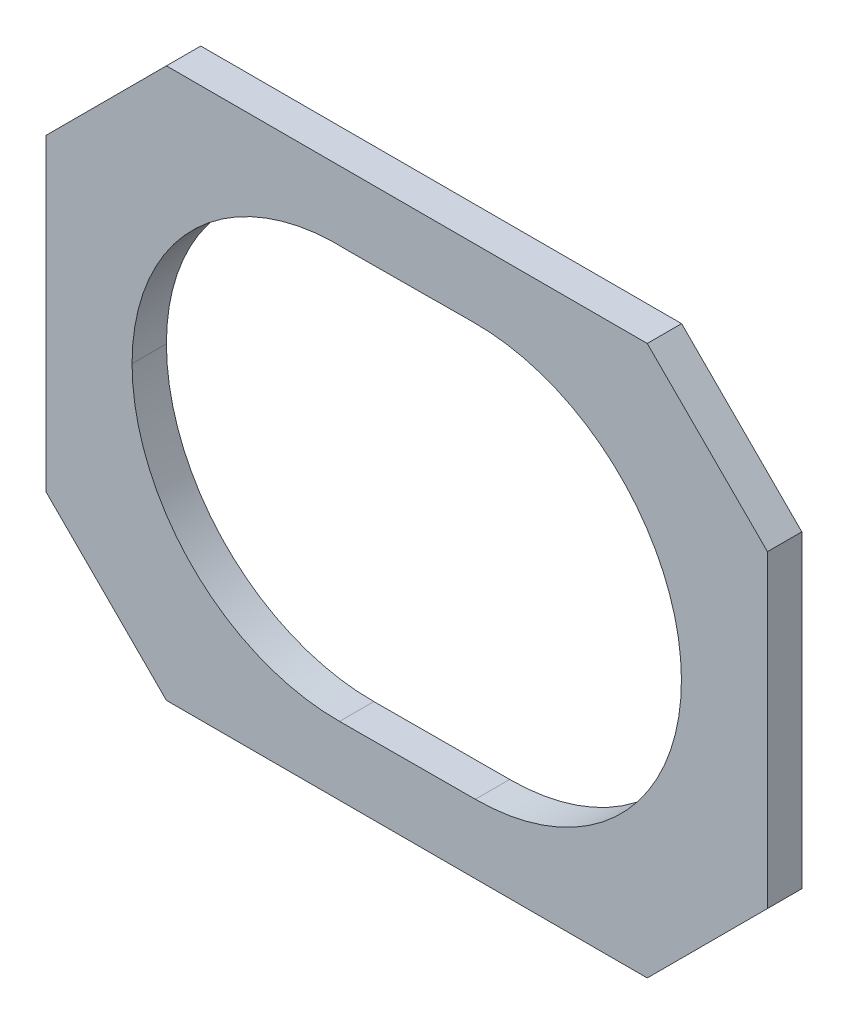
ISO-10303-21;
HEADER;
FILE_DESCRIPTION(('STEP AP214'),'2;1');
FILE_NAME('part.step','',(''),(''),'','','');
FILE_SCHEMA(('AUTOMOTIVE_DESIGN { 1 0 10303 214 1 1 1 1 }'));
ENDSEC;
DATA;
#1=APPLICATION_CONTEXT('core data for automotive mechanical design processes');
#2=APPLICATION_PROTOCOL_DEFINITION('international standard','automotive_design',2000,#1);
#3=PRODUCT_CONTEXT('',#1,'mechanical');
#4=PRODUCT('Part','Part','',(#3));
#5=PRODUCT_RELATED_PRODUCT_CATEGORY('part','',(#4));
#6=PRODUCT_DEFINITION_FORMATION('','',#4);
#7=PRODUCT_DEFINITION_CONTEXT('part definition',#1,'design');
#8=PRODUCT_DEFINITION('design','',#6,#7);
#9=PRODUCT_DEFINITION_SHAPE('','',#8);
#10=(LENGTH_UNIT() NAMED_UNIT(*) SI_UNIT(.MILLI.,.METRE.));
#11=(NAMED_UNIT(*) PLANE_ANGLE_UNIT() SI_UNIT($,.RADIAN.));
#12=(NAMED_UNIT(*) SI_UNIT($,.STERADIAN.) SOLID_ANGLE_UNIT());
#13=UNCERTAINTY_MEASURE_WITH_UNIT(LENGTH_MEASURE(1.E-05),#10,'distance_accuracy_value','');
#14=(GEOMETRIC_REPRESENTATION_CONTEXT(3) GLOBAL_UNCERTAINTY_ASSIGNED_CONTEXT((#13)) GLOBAL_UNIT_ASSIGNED_CONTEXT((#10,
#11,#12)) REPRESENTATION_CONTEXT('',''));
#15=CARTESIAN_POINT('',(0.,0.,0.));
#16=DIRECTION('',(0.,0.,1.));
#17=DIRECTION('',(1.,0.,0.));
#18=AXIS2_PLACEMENT_3D('',#15,#16,#17);
#19=CARTESIAN_POINT('',(-0.04374503514557,3.068360784084,3.606829571409));
#20=DIRECTION('',(0.,0.,1.));
#21=DIRECTION('',(1.,0.,0.));
#22=AXIS2_PLACEMENT_3D('',#19,#20,#21);
#23=PLANE('',#22);
#24=CARTESIAN_POINT('',(1.656259259739,4.666507166046,3.606829571409));
#25=DIRECTION('',(0.,0.,-1.));
#26=DIRECTION('',(-1.,0.,0.));
#27=AXIS2_PLACEMENT_3D('',#24,#25,#26);
#28=CIRCLE('',#27,1.2);
#29=CARTESIAN_POINT('',(1.664391127234,3.466534719391,3.606829571409));
#30=VERTEX_POINT('',#29);
#31=CARTESIAN_POINT('',(0.456259259739,4.666507166046,3.606829571409));
#32=VERTEX_POINT('',#31);
#33=EDGE_CURVE('E140',#30,#32,#28,.T.);
#34=ORIENTED_EDGE('',*,*,#33,.T.);
#35=CARTESIAN_POINT('',(1.656259259739,4.666507166046,3.606829571409));
#36=DIRECTION('',(0.,0.,-1.));
#37=DIRECTION('',(-1.,0.,0.));
#38=AXIS2_PLACEMENT_3D('',#35,#36,#37);
#39=CIRCLE('',#38,1.2);
#40=CARTESIAN_POINT('',(1.716955105197,5.864971189012,3.606829571409));
#41=VERTEX_POINT('',#40);
#42=EDGE_CURVE('E144',#32,#41,#39,.T.);
#43=ORIENTED_EDGE('',*,*,#42,.T.);
#44=DIRECTION('',(0.99998348462499,0.00574721473953194,0.));
#45=VECTOR('',#44,1.);
#46=CARTESIAN_POINT('',(1.716955105197,5.864971189012,3.606829571409));
#47=LINE('',#46,#45);
#48=CARTESIAN_POINT('',(2.441457582369,5.869135129096,3.606829571409));
#49=VERTEX_POINT('',#48);
#50=EDGE_CURVE('E44',#41,#49,#47,.T.);
#51=ORIENTED_EDGE('',*,*,#50,.T.);
#52=CARTESIAN_POINT('',(2.455250669942,4.669214402242,3.606829571409));
#53=DIRECTION('',(0.,0.,-1.));
#54=DIRECTION('',(-1.,0.,0.));
#55=AXIS2_PLACEMENT_3D('',#52,#53,#54);
#56=CIRCLE('',#55,1.2);
#57=CARTESIAN_POINT('',(2.455250669942,3.469214402242,3.606829571409));
#58=VERTEX_POINT('',#57);
#59=EDGE_CURVE('E276',#49,#58,#56,.T.);
#60=ORIENTED_EDGE('',*,*,#59,.T.);
#61=DIRECTION('',(-0.999994259703304,-0.00338829757277903,0.));
#62=VECTOR('',#61,1.);
#63=CARTESIAN_POINT('',(2.455250669942,3.469214402242,3.606829571409));
#64=LINE('',#63,#62);
#65=EDGE_CURVE('E11',#58,#30,#64,.T.);
#66=ORIENTED_EDGE('',*,*,#65,.T.);
#67=EDGE_LOOP('',(#34,#43,#51,#60,#66));
#68=FACE_BOUND('',#67,.T.);
#69=DIRECTION('',(-0.707106781149048,0.707106781224048,0.));
#70=VECTOR('',#69,1.);
#71=CARTESIAN_POINT('',(4.156254964827,5.568360784144,3.606829571409));
#72=LINE('',#71,#70);
#73=CARTESIAN_POINT('',(4.156254964827,5.568360784144,3.606829571409));
#74=VERTEX_POINT('',#73);
#75=CARTESIAN_POINT('',(3.45625496484,6.268360784203,3.606829571409));
#76=VERTEX_POINT('',#75);
#77=EDGE_CURVE('E174',#74,#76,#72,.T.);
#78=ORIENTED_EDGE('',*,*,#77,.T.);
#79=DIRECTION('',(-1.,0.,0.));
#80=VECTOR('',#79,1.);
#81=CARTESIAN_POINT('',(3.45625496484,6.268360784203,3.606829571409));
#82=LINE('',#81,#80);
#83=CARTESIAN_POINT('',(0.65625496484,6.268360784203,3.606829571409));
#84=VERTEX_POINT('',#83);
#85=EDGE_CURVE('E175',#76,#84,#82,.T.);
#86=ORIENTED_EDGE('',*,*,#85,.T.);
#87=DIRECTION('',(-0.707106781149048,-0.707106781224048,0.));
#88=VECTOR('',#87,1.);
#89=CARTESIAN_POINT('',(0.65625496484,6.268360784203,3.606829571409));
#90=LINE('',#89,#88);
#91=CARTESIAN_POINT('',(-0.04374503514557,5.568360784144,3.606829571409));
#92=VERTEX_POINT('',#91);
#93=EDGE_CURVE('E234',#84,#92,#90,.T.);
#94=ORIENTED_EDGE('',*,*,#93,.T.);
#95=DIRECTION('',(0.,-1.,0.));
#96=VECTOR('',#95,1.);
#97=CARTESIAN_POINT('',(-0.04374503514557,5.568360784144,3.606829571409));
#98=LINE('',#97,#96);
#99=CARTESIAN_POINT('',(-0.04374503514557,3.768360784144,3.606829571409));
#100=VERTEX_POINT('',#99);
#101=EDGE_CURVE('E211',#92,#100,#98,.T.);
#102=ORIENTED_EDGE('',*,*,#101,.T.);
#103=DIRECTION('',(0.707106781149048,-0.707106781224048,0.));
#104=VECTOR('',#103,1.);
#105=CARTESIAN_POINT('',(-0.04374503514557,3.768360784144,3.606829571409));
#106=LINE('',#105,#104);
#107=CARTESIAN_POINT('',(0.65625496484,3.068360784084,3.606829571409));
#108=VERTEX_POINT('',#107);
#109=EDGE_CURVE('E268',#100,#108,#106,.T.);
#110=ORIENTED_EDGE('',*,*,#109,.T.);
#111=DIRECTION('',(1.,0.,0.));
#112=VECTOR('',#111,1.);
#113=CARTESIAN_POINT('',(0.65625496484,3.068360784084,3.606829571409));
#114=LINE('',#113,#112);
#115=CARTESIAN_POINT('',(3.45625496484,3.068360784084,3.606829571409));
#116=VERTEX_POINT('',#115);
#117=EDGE_CURVE('E248',#108,#116,#114,.T.);
#118=ORIENTED_EDGE('',*,*,#117,.T.);
#119=DIRECTION('',(0.707106781149048,0.707106781224048,0.));
#120=VECTOR('',#119,1.);
#121=CARTESIAN_POINT('',(3.45625496484,3.068360784084,3.606829571409));
#122=LINE('',#121,#120);
#123=CARTESIAN_POINT('',(4.156254964827,3.768360784144,3.606829571409));
#124=VERTEX_POINT('',#123);
#125=EDGE_CURVE('E239',#116,#124,#122,.T.);
#126=ORIENTED_EDGE('',*,*,#125,.T.);
#127=DIRECTION('',(0.,1.,0.));
#128=VECTOR('',#127,1.);
#129=CARTESIAN_POINT('',(4.156254964827,3.768360784144,3.606829571409));
#130=LINE('',#129,#128);
#131=EDGE_CURVE('E240',#124,#74,#130,.T.);
#132=ORIENTED_EDGE('',*,*,#131,.T.);
#133=EDGE_LOOP('',(#78,#86,#94,#102,#110,#118,#126,#132));
#134=FACE_BOUND('',#133,.T.);
#135=ADVANCED_FACE('F17',(#68,#134),#23,.T.);
#136=CARTESIAN_POINT('',(2.455250669942,3.469214402242,3.606829571409));
#137=DIRECTION('',(0.00338829757277903,-0.999994259703304,0.));
#138=DIRECTION('',(0.,0.,-1.));
#139=AXIS2_PLACEMENT_3D('',#136,#137,#138);
#140=PLANE('',#139);
#141=DIRECTION('',(0.,0.,1.));
#142=VECTOR('',#141,1.);
#143=CARTESIAN_POINT('',(1.664391127234,3.466534719391,3.606829571409));
#144=LINE('',#143,#142);
#145=CARTESIAN_POINT('',(1.664391127234,3.466534719391,3.406829571409));
#146=VERTEX_POINT('',#145);
#147=EDGE_CURVE('E26',#146,#30,#144,.T.);
#148=ORIENTED_EDGE('',*,*,#147,.T.);
#149=ORIENTED_EDGE('',*,*,#65,.F.);
#150=DIRECTION('',(0.,0.,-1.));
#151=VECTOR('',#150,1.);
#152=CARTESIAN_POINT('',(2.455250669942,3.469214402242,3.606829571409));
#153=LINE('',#152,#151);
#154=CARTESIAN_POINT('',(2.455250669942,3.469214402242,3.406829571409));
#155=VERTEX_POINT('',#154);
#156=EDGE_CURVE('E214',#58,#155,#153,.T.);
#157=ORIENTED_EDGE('',*,*,#156,.T.);
#158=DIRECTION('',(-0.999994259703304,-0.00338829757278803,0.));
#159=VECTOR('',#158,1.);
#160=CARTESIAN_POINT('',(2.455250669942,3.469214402242,3.406829571409));
#161=LINE('',#160,#159);
#162=EDGE_CURVE('E188',#155,#146,#161,.T.);
#163=ORIENTED_EDGE('',*,*,#162,.T.);
#164=EDGE_LOOP('',(#148,#149,#157,#163));
#165=FACE_BOUND('',#164,.T.);
#166=ADVANCED_FACE('F290',(#165),#140,.F.);
#167=CARTESIAN_POINT('',(1.656259259739,4.666507166046,3.606829571409));
#168=DIRECTION('',(0.,0.,-1.));
#169=DIRECTION('',(-1.,0.,0.));
#170=AXIS2_PLACEMENT_3D('',#167,#168,#169);
#171=CYLINDRICAL_SURFACE('',#170,1.2);
#172=DIRECTION('',(0.,0.,-1.));
#173=VECTOR('',#172,1.);
#174=CARTESIAN_POINT('',(0.456259259739,4.666507166046,3.606829571409));
#175=LINE('',#174,#173);
#176=CARTESIAN_POINT('',(0.456259259739,4.666507166046,3.406829571409));
#177=VERTEX_POINT('',#176);
#178=EDGE_CURVE('E148',#32,#177,#175,.T.);
#179=ORIENTED_EDGE('',*,*,#178,.F.);
#180=ORIENTED_EDGE('',*,*,#33,.F.);
#181=ORIENTED_EDGE('',*,*,#147,.F.);
#182=CARTESIAN_POINT('',(1.656259259739,4.666507166046,3.406829571409));
#183=DIRECTION('',(0.,0.,-1.));
#184=DIRECTION('',(-1.,0.,0.));
#185=AXIS2_PLACEMENT_3D('',#182,#183,#184);
#186=CIRCLE('',#185,1.2);
#187=EDGE_CURVE('E150',#146,#177,#186,.T.);
#188=ORIENTED_EDGE('',*,*,#187,.T.);
#189=EDGE_LOOP('',(#179,#180,#181,#188));
#190=FACE_BOUND('',#189,.T.);
#191=ADVANCED_FACE('F19',(#190),#171,.F.);
#192=CARTESIAN_POINT('',(1.716955105197,5.864971189012,3.606829571409));
#193=DIRECTION('',(-0.00574721473953194,0.99998348462499,0.));
#194=DIRECTION('',(0.,0.,1.));
#195=AXIS2_PLACEMENT_3D('',#192,#193,#194);
#196=PLANE('',#195);
#197=DIRECTION('',(0.,0.,1.));
#198=VECTOR('',#197,1.);
#199=CARTESIAN_POINT('',(2.441457582369,5.869135129096,3.606829571409));
#200=LINE('',#199,#198);
#201=CARTESIAN_POINT('',(2.441457582369,5.869135129096,3.406829571409));
#202=VERTEX_POINT('',#201);
#203=EDGE_CURVE('E279',#202,#49,#200,.T.);
#204=ORIENTED_EDGE('',*,*,#203,.T.);
#205=ORIENTED_EDGE('',*,*,#50,.F.);
#206=DIRECTION('',(0.,0.,1.));
#207=VECTOR('',#206,1.);
#208=CARTESIAN_POINT('',(1.716955105197,5.864971189012,3.606829571409));
#209=LINE('',#208,#207);
#210=CARTESIAN_POINT('',(1.716955105197,5.864971189012,3.406829571409));
#211=VERTEX_POINT('',#210);
#212=EDGE_CURVE('E160',#211,#41,#209,.T.);
#213=ORIENTED_EDGE('',*,*,#212,.F.);
#214=DIRECTION('',(0.99998348462499,0.00574721473953994,0.));
#215=VECTOR('',#214,1.);
#216=CARTESIAN_POINT('',(1.716955105197,5.864971189012,3.406829571409));
#217=LINE('',#216,#215);
#218=EDGE_CURVE('E195',#211,#202,#217,.T.);
#219=ORIENTED_EDGE('',*,*,#218,.T.);
#220=EDGE_LOOP('',(#204,#205,#213,#219));
#221=FACE_BOUND('',#220,.T.);
#222=ADVANCED_FACE('F344',(#221),#196,.F.);
#223=CARTESIAN_POINT('',(2.455250669942,4.669214402242,3.606829571409));
#224=DIRECTION('',(0.,0.,-1.));
#225=DIRECTION('',(-1.,0.,0.));
#226=AXIS2_PLACEMENT_3D('',#223,#224,#225);
#227=CYLINDRICAL_SURFACE('',#226,1.2);
#228=ORIENTED_EDGE('',*,*,#156,.F.);
#229=ORIENTED_EDGE('',*,*,#59,.F.);
#230=ORIENTED_EDGE('',*,*,#203,.F.);
#231=CARTESIAN_POINT('',(2.455250669942,4.669214402242,3.406829571409));
#232=DIRECTION('',(0.,0.,-1.));
#233=DIRECTION('',(-1.,0.,0.));
#234=AXIS2_PLACEMENT_3D('',#231,#232,#233);
#235=CIRCLE('',#234,1.2);
#236=EDGE_CURVE('E192',#202,#155,#235,.T.);
#237=ORIENTED_EDGE('',*,*,#236,.T.);
#238=EDGE_LOOP('',(#228,#229,#230,#237));
#239=FACE_BOUND('',#238,.T.);
#240=ADVANCED_FACE('F349',(#239),#227,.F.);
#241=CARTESIAN_POINT('',(-0.04374503514557,5.568360784144,3.606829571409));
#242=DIRECTION('',(1.,0.,0.));
#243=DIRECTION('',(0.,1.,0.));
#244=AXIS2_PLACEMENT_3D('',#241,#242,#243);
#245=PLANE('',#244);
#246=DIRECTION('',(0.,0.,1.));
#247=VECTOR('',#246,1.);
#248=CARTESIAN_POINT('',(-0.04374503514557,3.768360784144,3.606829571409));
#249=LINE('',#248,#247);
#250=CARTESIAN_POINT('',(-0.04374503514557,3.768360784144,3.406829571409));
#251=VERTEX_POINT('',#250);
#252=EDGE_CURVE('E215',#251,#100,#249,.T.);
#253=ORIENTED_EDGE('',*,*,#252,.T.);
#254=ORIENTED_EDGE('',*,*,#101,.F.);
#255=DIRECTION('',(0.,0.,-1.));
#256=VECTOR('',#255,1.);
#257=CARTESIAN_POINT('',(-0.04374503514557,5.568360784144,3.606829571409));
#258=LINE('',#257,#256);
#259=CARTESIAN_POINT('',(-0.04374503514557,5.568360784144,3.406829571409));
#260=VERTEX_POINT('',#259);
#261=EDGE_CURVE('E231',#92,#260,#258,.T.);
#262=ORIENTED_EDGE('',*,*,#261,.T.);
#263=DIRECTION('',(0.,-1.,0.));
#264=VECTOR('',#263,1.);
#265=CARTESIAN_POINT('',(-0.04374503514557,3.068360784084,3.406829571409));
#266=LINE('',#265,#264);
#267=EDGE_CURVE('E166',#260,#251,#266,.T.);
#268=ORIENTED_EDGE('',*,*,#267,.T.);
#269=EDGE_LOOP('',(#253,#254,#262,#268));
#270=FACE_BOUND('',#269,.T.);
#271=ADVANCED_FACE('F307',(#270),#245,.F.);
#272=CARTESIAN_POINT('',(-0.04374503514557,3.768360784144,3.606829571409));
#273=DIRECTION('',(0.707106781224048,0.707106781149048,0.));
#274=DIRECTION('',(0.,0.,-1.));
#275=AXIS2_PLACEMENT_3D('',#272,#273,#274);
#276=PLANE('',#275);
#277=DIRECTION('',(0.,0.,1.));
#278=VECTOR('',#277,1.);
#279=CARTESIAN_POINT('',(0.65625496484,3.068360784084,3.606829571409));
#280=LINE('',#279,#278);
#281=CARTESIAN_POINT('',(0.65625496484,3.068360784084,3.406829571409));
#282=VERTEX_POINT('',#281);
#283=EDGE_CURVE('E264',#282,#108,#280,.T.);
#284=ORIENTED_EDGE('',*,*,#283,.T.);
#285=ORIENTED_EDGE('',*,*,#109,.F.);
#286=ORIENTED_EDGE('',*,*,#252,.F.);
#287=DIRECTION('',(0.707106781149048,-0.707106781224048,0.));
#288=VECTOR('',#287,1.);
#289=CARTESIAN_POINT('',(-0.04374503514557,3.768360784144,3.406829571409));
#290=LINE('',#289,#288);
#291=EDGE_CURVE('E170',#251,#282,#290,.T.);
#292=ORIENTED_EDGE('',*,*,#291,.T.);
#293=EDGE_LOOP('',(#284,#285,#286,#292));
#294=FACE_BOUND('',#293,.T.);
#295=ADVANCED_FACE('F301',(#294),#276,.F.);
#296=CARTESIAN_POINT('',(0.65625496484,3.068360784084,3.606829571409));
#297=DIRECTION('',(0.,1.,0.));
#298=DIRECTION('',(1.,0.,0.));
#299=AXIS2_PLACEMENT_3D('',#296,#297,#298);
#300=PLANE('',#299);
#301=DIRECTION('',(0.,0.,1.));
#302=VECTOR('',#301,1.);
#303=CARTESIAN_POINT('',(3.45625496484,3.068360784084,3.606829571409));
#304=LINE('',#303,#302);
#305=CARTESIAN_POINT('',(3.45625496484,3.068360784084,3.406829571409));
#306=VERTEX_POINT('',#305);
#307=EDGE_CURVE('E244',#306,#116,#304,.T.);
#308=ORIENTED_EDGE('',*,*,#307,.T.);
#309=ORIENTED_EDGE('',*,*,#117,.F.);
#310=ORIENTED_EDGE('',*,*,#283,.F.);
#311=DIRECTION('',(1.,0.,0.));
#312=VECTOR('',#311,1.);
#313=CARTESIAN_POINT('',(-0.04374503514557,3.068360784084,3.406829571409));
#314=LINE('',#313,#312);
#315=EDGE_CURVE('E181',#282,#306,#314,.T.);
#316=ORIENTED_EDGE('',*,*,#315,.T.);
#317=EDGE_LOOP('',(#308,#309,#310,#316));
#318=FACE_BOUND('',#317,.T.);
#319=ADVANCED_FACE('F306',(#318),#300,.F.);
#320=CARTESIAN_POINT('',(3.45625496484,3.068360784084,3.606829571409));
#321=DIRECTION('',(-0.707106781224048,0.707106781149048,0.));
#322=DIRECTION('',(0.,0.,1.));
#323=AXIS2_PLACEMENT_3D('',#320,#321,#322);
#324=PLANE('',#323);
#325=DIRECTION('',(0.,0.,1.));
#326=VECTOR('',#325,1.);
#327=CARTESIAN_POINT('',(4.156254964827,3.768360784144,3.606829571409));
#328=LINE('',#327,#326);
#329=CARTESIAN_POINT('',(4.156254964827,3.768360784144,3.406829571409));
#330=VERTEX_POINT('',#329);
#331=EDGE_CURVE('E235',#330,#124,#328,.T.);
#332=ORIENTED_EDGE('',*,*,#331,.T.);
#333=ORIENTED_EDGE('',*,*,#125,.F.);
#334=ORIENTED_EDGE('',*,*,#307,.F.);
#335=DIRECTION('',(0.707106781149048,0.707106781224048,0.));
#336=VECTOR('',#335,1.);
#337=CARTESIAN_POINT('',(3.45625496484,3.068360784084,3.406829571409));
#338=LINE('',#337,#336);
#339=EDGE_CURVE('E177',#306,#330,#338,.T.);
#340=ORIENTED_EDGE('',*,*,#339,.T.);
#341=EDGE_LOOP('',(#332,#333,#334,#340));
#342=FACE_BOUND('',#341,.T.);
#343=ADVANCED_FACE('F369',(#342),#324,.F.);
#344=CARTESIAN_POINT('',(4.156254964827,3.768360784144,3.606829571409));
#345=DIRECTION('',(-1.,0.,0.));
#346=DIRECTION('',(0.,0.,1.));
#347=AXIS2_PLACEMENT_3D('',#344,#345,#346);
#348=PLANE('',#347);
#349=DIRECTION('',(0.,0.,1.));
#350=VECTOR('',#349,1.);
#351=CARTESIAN_POINT('',(4.156254964827,5.568360784144,3.606829571409));
#352=LINE('',#351,#350);
#353=CARTESIAN_POINT('',(4.156254964827,5.568360784144,3.406829571409));
#354=VERTEX_POINT('',#353);
#355=EDGE_CURVE('E254',#354,#74,#352,.T.);
#356=ORIENTED_EDGE('',*,*,#355,.T.);
#357=ORIENTED_EDGE('',*,*,#131,.F.);
#358=ORIENTED_EDGE('',*,*,#331,.F.);
#359=DIRECTION('',(0.,1.,0.));
#360=VECTOR('',#359,1.);
#361=CARTESIAN_POINT('',(4.156254964827,3.068360784084,3.406829571409));
#362=LINE('',#361,#360);
#363=EDGE_CURVE('E182',#330,#354,#362,.T.);
#364=ORIENTED_EDGE('',*,*,#363,.T.);
#365=EDGE_LOOP('',(#356,#357,#358,#364));
#366=FACE_BOUND('',#365,.T.);
#367=ADVANCED_FACE('F377',(#366),#348,.F.);
#368=CARTESIAN_POINT('',(4.156254964827,5.568360784144,3.606829571409));
#369=DIRECTION('',(-0.707106781224048,-0.707106781149048,0.));
#370=DIRECTION('',(-0.707106781149048,0.707106781224048,0.));
#371=AXIS2_PLACEMENT_3D('',#368,#369,#370);
#372=PLANE('',#371);
#373=DIRECTION('',(0.,0.,1.));
#374=VECTOR('',#373,1.);
#375=CARTESIAN_POINT('',(3.45625496484,6.268360784203,3.606829571409));
#376=LINE('',#375,#374);
#377=CARTESIAN_POINT('',(3.45625496484,6.268360784203,3.406829571409));
#378=VERTEX_POINT('',#377);
#379=EDGE_CURVE('E171',#378,#76,#376,.T.);
#380=ORIENTED_EDGE('',*,*,#379,.T.);
#381=ORIENTED_EDGE('',*,*,#77,.F.);
#382=ORIENTED_EDGE('',*,*,#355,.F.);
#383=DIRECTION('',(-0.707106781149048,0.707106781224048,0.));
#384=VECTOR('',#383,1.);
#385=CARTESIAN_POINT('',(4.156254964827,5.568360784144,3.406829571409));
#386=LINE('',#385,#384);
#387=EDGE_CURVE('E199',#354,#378,#386,.T.);
#388=ORIENTED_EDGE('',*,*,#387,.T.);
#389=EDGE_LOOP('',(#380,#381,#382,#388));
#390=FACE_BOUND('',#389,.T.);
#391=ADVANCED_FACE('F319',(#390),#372,.F.);
#392=CARTESIAN_POINT('',(3.45625496484,6.268360784203,3.606829571409));
#393=DIRECTION('',(0.,-1.,0.));
#394=DIRECTION('',(0.,0.,-1.));
#395=AXIS2_PLACEMENT_3D('',#392,#393,#394);
#396=PLANE('',#395);
#397=DIRECTION('',(0.,0.,1.));
#398=VECTOR('',#397,1.);
#399=CARTESIAN_POINT('',(0.65625496484,6.268360784203,3.606829571409));
#400=LINE('',#399,#398);
#401=CARTESIAN_POINT('',(0.65625496484,6.268360784203,3.406829571409));
#402=VERTEX_POINT('',#401);
#403=EDGE_CURVE('E207',#402,#84,#400,.T.);
#404=ORIENTED_EDGE('',*,*,#403,.T.);
#405=ORIENTED_EDGE('',*,*,#85,.F.);
#406=ORIENTED_EDGE('',*,*,#379,.F.);
#407=DIRECTION('',(-1.,0.,0.));
#408=VECTOR('',#407,1.);
#409=CARTESIAN_POINT('',(-0.04374503514557,6.268360784203,3.406829571409));
#410=LINE('',#409,#408);
#411=EDGE_CURVE('E187',#378,#402,#410,.T.);
#412=ORIENTED_EDGE('',*,*,#411,.T.);
#413=EDGE_LOOP('',(#404,#405,#406,#412));
#414=FACE_BOUND('',#413,.T.);
#415=ADVANCED_FACE('F313',(#414),#396,.F.);
#416=CARTESIAN_POINT('',(0.65625496484,6.268360784203,3.606829571409));
#417=DIRECTION('',(0.707106781224048,-0.707106781149048,0.));
#418=DIRECTION('',(0.,0.,-1.));
#419=AXIS2_PLACEMENT_3D('',#416,#417,#418);
#420=PLANE('',#419);
#421=ORIENTED_EDGE('',*,*,#261,.F.);
#422=ORIENTED_EDGE('',*,*,#93,.F.);
#423=ORIENTED_EDGE('',*,*,#403,.F.);
#424=DIRECTION('',(-0.707106781149048,-0.707106781224048,0.));
#425=VECTOR('',#424,1.);
#426=CARTESIAN_POINT('',(0.65625496484,6.268360784203,3.406829571409));
#427=LINE('',#426,#425);
#428=EDGE_CURVE('E169',#402,#260,#427,.T.);
#429=ORIENTED_EDGE('',*,*,#428,.T.);
#430=EDGE_LOOP('',(#421,#422,#423,#429));
#431=FACE_BOUND('',#430,.T.);
#432=ADVANCED_FACE('F318',(#431),#420,.F.);
#433=CARTESIAN_POINT('',(-0.04374503514557,3.068360784084,3.406829571409));
#434=DIRECTION('',(0.,0.,1.));
#435=DIRECTION('',(1.,0.,0.));
#436=AXIS2_PLACEMENT_3D('',#433,#434,#435);
#437=PLANE('',#436);
#438=ORIENTED_EDGE('',*,*,#218,.F.);
#439=CARTESIAN_POINT('',(1.656259259739,4.666507166046,3.406829571409));
#440=DIRECTION('',(0.,0.,-1.));
#441=DIRECTION('',(-1.,0.,0.));
#442=AXIS2_PLACEMENT_3D('',#439,#440,#441);
#443=CIRCLE('',#442,1.2);
#444=EDGE_CURVE('E155',#177,#211,#443,.T.);
#445=ORIENTED_EDGE('',*,*,#444,.F.);
#446=ORIENTED_EDGE('',*,*,#187,.F.);
#447=ORIENTED_EDGE('',*,*,#162,.F.);
#448=ORIENTED_EDGE('',*,*,#236,.F.);
#449=EDGE_LOOP('',(#438,#445,#446,#447,#448));
#450=FACE_BOUND('',#449,.T.);
#451=ORIENTED_EDGE('',*,*,#411,.F.);
#452=ORIENTED_EDGE('',*,*,#387,.F.);
#453=ORIENTED_EDGE('',*,*,#363,.F.);
#454=ORIENTED_EDGE('',*,*,#339,.F.);
#455=ORIENTED_EDGE('',*,*,#315,.F.);
#456=ORIENTED_EDGE('',*,*,#291,.F.);
#457=ORIENTED_EDGE('',*,*,#267,.F.);
#458=ORIENTED_EDGE('',*,*,#428,.F.);
#459=EDGE_LOOP('',(#451,#452,#453,#454,#455,#456,#457,#458));
#460=FACE_BOUND('',#459,.T.);
#461=ADVANCED_FACE('F329',(#450,#460),#437,.F.);
#462=CARTESIAN_POINT('',(1.656259259739,4.666507166046,3.606829571409));
#463=DIRECTION('',(0.,0.,-1.));
#464=DIRECTION('',(-1.,0.,0.));
#465=AXIS2_PLACEMENT_3D('',#462,#463,#464);
#466=CYLINDRICAL_SURFACE('',#465,1.2);
#467=ORIENTED_EDGE('',*,*,#42,.F.);
#468=ORIENTED_EDGE('',*,*,#178,.T.);
#469=ORIENTED_EDGE('',*,*,#444,.T.);
#470=ORIENTED_EDGE('',*,*,#212,.T.);
#471=EDGE_LOOP('',(#467,#468,#469,#470));
#472=FACE_BOUND('',#471,.T.);
#473=ADVANCED_FACE('F158',(#472),#466,.F.);
#474=CLOSED_SHELL('',(#135,#166,#191,#222,#240,#271,#295,#319,#343,#367,#391,#415,#432,#461,#473));
#475=MANIFOLD_SOLID_BREP('B1',#474);
#476=ADVANCED_BREP_SHAPE_REPRESENTATION('',(#18,#475),#14);
#477=SHAPE_DEFINITION_REPRESENTATION(#9,#476);
ENDSEC;
END-ISO-10303-21;
